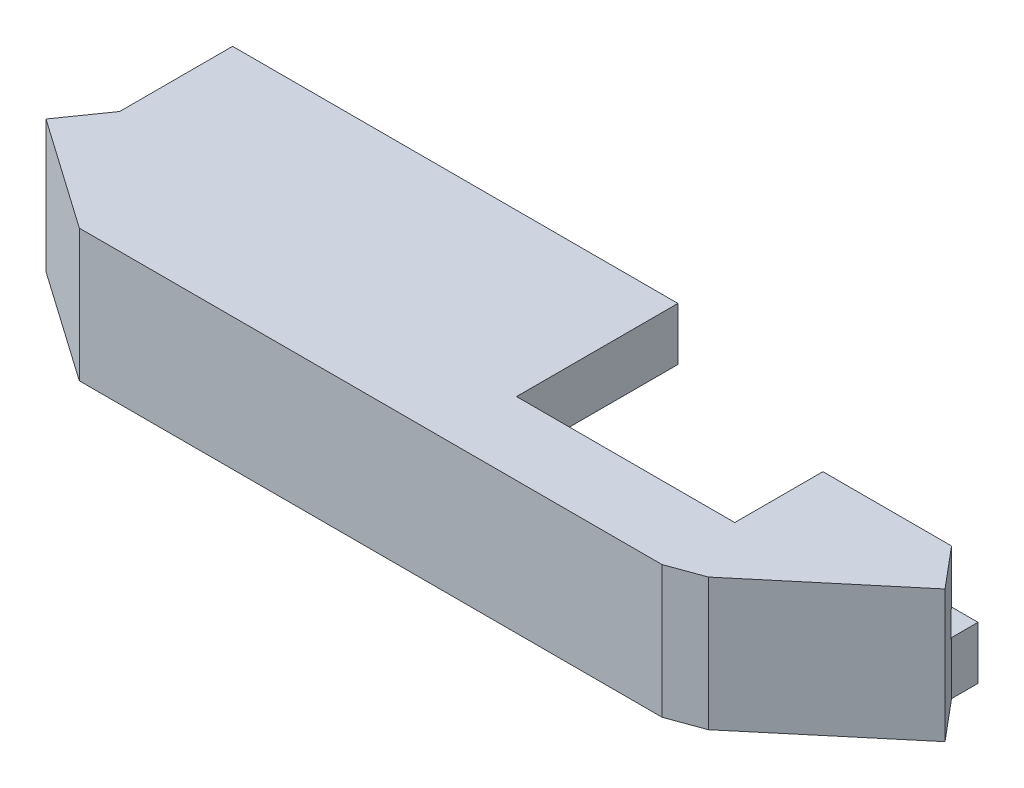
ISO-10303-21;
HEADER;
FILE_DESCRIPTION(('STEP AP214'),'2;1');
FILE_NAME('part.step','',(''),(''),'','','');
FILE_SCHEMA(('AUTOMOTIVE_DESIGN { 1 0 10303 214 1 1 1 1 }'));
ENDSEC;
DATA;
#1=APPLICATION_CONTEXT('core data for automotive mechanical design processes');
#2=APPLICATION_PROTOCOL_DEFINITION('international standard','automotive_design',2000,#1);
#3=PRODUCT_CONTEXT('',#1,'mechanical');
#4=PRODUCT('Part','Part','',(#3));
#5=PRODUCT_RELATED_PRODUCT_CATEGORY('part','',(#4));
#6=PRODUCT_DEFINITION_FORMATION('','',#4);
#7=PRODUCT_DEFINITION_CONTEXT('part definition',#1,'design');
#8=PRODUCT_DEFINITION('design','',#6,#7);
#9=PRODUCT_DEFINITION_SHAPE('','',#8);
#10=(LENGTH_UNIT() NAMED_UNIT(*) SI_UNIT(.MILLI.,.METRE.));
#11=(NAMED_UNIT(*) PLANE_ANGLE_UNIT() SI_UNIT($,.RADIAN.));
#12=(NAMED_UNIT(*) SI_UNIT($,.STERADIAN.) SOLID_ANGLE_UNIT());
#13=UNCERTAINTY_MEASURE_WITH_UNIT(LENGTH_MEASURE(1.E-05),#10,'distance_accuracy_value','');
#14=(GEOMETRIC_REPRESENTATION_CONTEXT(3) GLOBAL_UNCERTAINTY_ASSIGNED_CONTEXT((#13)) GLOBAL_UNIT_ASSIGNED_CONTEXT((#10,
#11,#12)) REPRESENTATION_CONTEXT('',''));
#15=CARTESIAN_POINT('',(0.,0.,0.));
#16=DIRECTION('',(0.,0.,1.));
#17=DIRECTION('',(1.,0.,0.));
#18=AXIS2_PLACEMENT_3D('',#15,#16,#17);
#19=CARTESIAN_POINT('',(0.,0.,0.));
#20=DIRECTION('',(0.,1.,0.));
#21=DIRECTION('',(0.,0.,1.));
#22=AXIS2_PLACEMENT_3D('',#19,#20,#21);
#23=PLANE('',#22);
#24=DIRECTION('',(0.819152044288997,0.,0.573576436351038));
#25=VECTOR('',#24,1.);
#26=CARTESIAN_POINT('',(-0.172072930905292,0.,0.245745613286671));
#27=LINE('',#26,#25);
#28=CARTESIAN_POINT('',(-7.54444132950627,0.,-4.91644231387267));
#29=VERTEX_POINT('',#28);
#30=CARTESIAN_POINT('',(-0.0945896366636159,0.,0.300000000000012));
#31=VERTEX_POINT('',#30);
#32=EDGE_CURVE('E391',#29,#31,#27,.T.);
#33=ORIENTED_EDGE('',*,*,#32,.F.);
#34=DIRECTION('',(-0.573576436351033,0.,0.819152044289002));
#35=VECTOR('',#34,1.);
#36=CARTESIAN_POINT('',(-7.37236839860101,0.,-5.16218792715929));
#37=LINE('',#36,#35);
#38=CARTESIAN_POINT('',(-7.37236839860095,0.,-5.16218792715937));
#39=VERTEX_POINT('',#38);
#40=EDGE_CURVE('E443',#39,#29,#37,.T.);
#41=ORIENTED_EDGE('',*,*,#40,.F.);
#42=DIRECTION('',(0.,0.,-1.));
#43=VECTOR('',#42,1.);
#44=CARTESIAN_POINT('',(-7.37236839860096,0.,0.));
#45=LINE('',#44,#43);
#46=CARTESIAN_POINT('',(-7.37236839860095,0.,-13.7));
#47=VERTEX_POINT('',#46);
#48=EDGE_CURVE('E500',#39,#47,#45,.T.);
#49=ORIENTED_EDGE('',*,*,#48,.T.);
#50=DIRECTION('',(-1.,0.,0.));
#51=VECTOR('',#50,1.);
#52=CARTESIAN_POINT('',(0.,0.,-13.7));
#53=LINE('',#52,#51);
#54=CARTESIAN_POINT('',(26.3,0.,-13.7));
#55=VERTEX_POINT('',#54);
#56=EDGE_CURVE('E496',#55,#47,#53,.T.);
#57=ORIENTED_EDGE('',*,*,#56,.F.);
#58=DIRECTION('',(0.,0.,-1.));
#59=VECTOR('',#58,1.);
#60=CARTESIAN_POINT('',(26.3,0.,0.));
#61=LINE('',#60,#59);
#62=CARTESIAN_POINT('',(26.3,0.,-1.5));
#63=VERTEX_POINT('',#62);
#64=EDGE_CURVE('E493',#63,#55,#61,.T.);
#65=ORIENTED_EDGE('',*,*,#64,.F.);
#66=DIRECTION('',(-1.,0.,0.));
#67=VECTOR('',#66,1.);
#68=CARTESIAN_POINT('',(0.,0.,-1.5));
#69=LINE('',#68,#67);
#70=CARTESIAN_POINT('',(42.8,0.,-1.5));
#71=VERTEX_POINT('',#70);
#72=EDGE_CURVE('E490',#71,#63,#69,.T.);
#73=ORIENTED_EDGE('',*,*,#72,.F.);
#74=DIRECTION('',(0.,0.,-1.));
#75=VECTOR('',#74,1.);
#76=CARTESIAN_POINT('',(42.8,0.,0.));
#77=LINE('',#76,#75);
#78=CARTESIAN_POINT('',(42.8,0.,-8.16340264301906));
#79=VERTEX_POINT('',#78);
#80=EDGE_CURVE('E486',#71,#79,#77,.T.);
#81=ORIENTED_EDGE('',*,*,#80,.T.);
#82=DIRECTION('',(-1.,0.,0.));
#83=VECTOR('',#82,1.);
#84=CARTESIAN_POINT('',(0.,0.,-8.16340264301906));
#85=LINE('',#84,#83);
#86=CARTESIAN_POINT('',(52.528764427611,0.,-8.16340264301906));
#87=VERTEX_POINT('',#86);
#88=EDGE_CURVE('E482',#87,#79,#85,.T.);
#89=ORIENTED_EDGE('',*,*,#88,.F.);
#90=DIRECTION('',(0.642787609686541,0.,0.766044443118976));
#91=VECTOR('',#90,1.);
#92=CARTESIAN_POINT('',(34.8448354296832,0.,-29.2382885574803));
#93=LINE('',#92,#91);
#94=CARTESIAN_POINT('',(52.721600710517,0.,-7.93358931008336));
#95=VERTEX_POINT('',#94);
#96=EDGE_CURVE('E406',#87,#95,#93,.T.);
#97=ORIENTED_EDGE('',*,*,#96,.T.);
#98=DIRECTION('',(0.766044443118977,0.,-0.64278760968654));
#99=VECTOR('',#98,1.);
#100=CARTESIAN_POINT('',(17.8767652808337,0.,21.304699247397));
#101=LINE('',#100,#99);
#102=CARTESIAN_POINT('',(42.992836282906,0.,0.22981333293569));
#103=VERTEX_POINT('',#102);
#104=EDGE_CURVE('E394',#103,#95,#101,.T.);
#105=ORIENTED_EDGE('',*,*,#104,.F.);
#106=DIRECTION('',(0.939692620785911,0.,-0.342020143325663));
#107=VECTOR('',#106,1.);
#108=CARTESIAN_POINT('',(5.10306705870667,0.,14.0205615137596));
#109=LINE('',#108,#107);
#110=CARTESIAN_POINT('',(42.8,0.,0.3));
#111=VERTEX_POINT('',#110);
#112=EDGE_CURVE('E398',#111,#103,#109,.T.);
#113=ORIENTED_EDGE('',*,*,#112,.F.);
#114=DIRECTION('',(1.,0.,0.));
#115=VECTOR('',#114,1.);
#116=CARTESIAN_POINT('',(0.,0.,0.3));
#117=LINE('',#116,#115);
#118=CARTESIAN_POINT('',(18.0588159097779,0.,0.3));
#119=VERTEX_POINT('',#118);
#120=EDGE_CURVE('E362',#119,#111,#117,.T.);
#121=ORIENTED_EDGE('',*,*,#120,.F.);
#122=DIRECTION('',(0.,0.,-1.));
#123=VECTOR('',#122,1.);
#124=CARTESIAN_POINT('',(18.0588159097779,0.,0.));
#125=LINE('',#124,#123);
#126=CARTESIAN_POINT('',(18.0588159097779,0.,-0.607570660968912));
#127=VERTEX_POINT('',#126);
#128=EDGE_CURVE('E246',#119,#127,#125,.T.);
#129=ORIENTED_EDGE('',*,*,#128,.T.);
#130=CARTESIAN_POINT('',(13.15,0.,0.95));
#131=DIRECTION('',(0.,1.,0.));
#132=DIRECTION('',(0.,0.,1.));
#133=AXIS2_PLACEMENT_3D('',#130,#131,#132);
#134=CIRCLE('',#133,5.15);
#135=CARTESIAN_POINT('',(8.24118409022208,0.,-0.607570660968924));
#136=VERTEX_POINT('',#135);
#137=EDGE_CURVE('E384',#127,#136,#134,.T.);
#138=ORIENTED_EDGE('',*,*,#137,.T.);
#139=DIRECTION('',(0.,0.,-1.));
#140=VECTOR('',#139,1.);
#141=CARTESIAN_POINT('',(8.24118409022208,0.,0.));
#142=LINE('',#141,#140);
#143=CARTESIAN_POINT('',(8.24118409022208,0.,0.300000000000003));
#144=VERTEX_POINT('',#143);
#145=EDGE_CURVE('E66',#144,#136,#142,.T.);
#146=ORIENTED_EDGE('',*,*,#145,.F.);
#147=EDGE_CURVE('E61',#31,#144,#117,.T.);
#148=ORIENTED_EDGE('',*,*,#147,.F.);
#149=EDGE_LOOP('',(#33,#41,#49,#57,#65,#73,#81,#89,#97,#105,#113,#121,#129,#138,#146,#148));
#150=FACE_BOUND('',#149,.T.);
#151=ADVANCED_FACE('F45',(#150),#23,.F.);
#152=CARTESIAN_POINT('',(20.2550794366737,4.,24.1390636869372));
#153=DIRECTION('',(-0.642787609686537,0.,-0.76604444311898));
#154=DIRECTION('',(-0.76604444311898,0.,0.642787609686537));
#155=AXIS2_PLACEMENT_3D('',#152,#153,#154);
#156=PLANE('',#155);
#157=DIRECTION('',(0.,-1.,0.));
#158=VECTOR('',#157,1.);
#159=CARTESIAN_POINT('',(45.3711504387462,4.,3.06417777247591));
#160=LINE('',#159,#158);
#161=CARTESIAN_POINT('',(45.3711504387462,4.,3.06417777247591));
#162=VERTEX_POINT('',#161);
#163=CARTESIAN_POINT('',(45.3711504387462,-6.,3.06417777247592));
#164=VERTEX_POINT('',#163);
#165=EDGE_CURVE('E479',#162,#164,#160,.T.);
#166=ORIENTED_EDGE('',*,*,#165,.T.);
#167=DIRECTION('',(0.76604444311898,0.,-0.642787609686537));
#168=VECTOR('',#167,1.);
#169=CARTESIAN_POINT('',(20.2550794366737,-6.,24.1390636869372));
#170=LINE('',#169,#168);
#171=CARTESIAN_POINT('',(55.0999148663572,-6.,-5.0992248705431));
#172=VERTEX_POINT('',#171);
#173=EDGE_CURVE('E259',#164,#172,#170,.T.);
#174=ORIENTED_EDGE('',*,*,#173,.T.);
#175=DIRECTION('',(0.,-1.,0.));
#176=VECTOR('',#175,1.);
#177=CARTESIAN_POINT('',(55.0999148663572,4.,-5.0992248705431));
#178=LINE('',#177,#176);
#179=CARTESIAN_POINT('',(55.0999148663572,4.,-5.0992248705431));
#180=VERTEX_POINT('',#179);
#181=EDGE_CURVE('E11',#180,#172,#178,.T.);
#182=ORIENTED_EDGE('',*,*,#181,.F.);
#183=DIRECTION('',(0.76604444311898,0.,-0.642787609686537));
#184=VECTOR('',#183,1.);
#185=CARTESIAN_POINT('',(20.2550794366737,4.,24.1390636869372));
#186=LINE('',#185,#184);
#187=EDGE_CURVE('E439',#162,#180,#186,.T.);
#188=ORIENTED_EDGE('',*,*,#187,.F.);
#189=EDGE_LOOP('',(#166,#174,#182,#188));
#190=FACE_BOUND('',#189,.T.);
#191=ADVANCED_FACE('F47',(#190),#156,.F.);
#192=CARTESIAN_POINT('',(34.8448354296832,4.,-29.2382885574803));
#193=DIRECTION('',(0.766044443118976,0.,-0.642787609686541));
#194=DIRECTION('',(-0.642787609686541,0.,-0.766044443118976));
#195=AXIS2_PLACEMENT_3D('',#192,#193,#194);
#196=PLANE('',#195);
#197=ORIENTED_EDGE('',*,*,#96,.F.);
#198=DIRECTION('',(0.,-1.,0.));
#199=VECTOR('',#198,1.);
#200=CARTESIAN_POINT('',(52.528764427611,4.,-8.16340264301906));
#201=LINE('',#200,#199);
#202=CARTESIAN_POINT('',(52.528764427611,4.,-8.16340264301906));
#203=VERTEX_POINT('',#202);
#204=EDGE_CURVE('E54',#203,#87,#201,.T.);
#205=ORIENTED_EDGE('',*,*,#204,.F.);
#206=DIRECTION('',(0.642787609686541,0.,0.766044443118976));
#207=VECTOR('',#206,1.);
#208=CARTESIAN_POINT('',(34.8448354296832,4.,-29.2382885574803));
#209=LINE('',#208,#207);
#210=EDGE_CURVE('E442',#203,#180,#209,.T.);
#211=ORIENTED_EDGE('',*,*,#210,.T.);
#212=ORIENTED_EDGE('',*,*,#181,.T.);
#213=DIRECTION('',(0.642787609686538,0.,0.76604444311898));
#214=VECTOR('',#213,1.);
#215=CARTESIAN_POINT('',(34.8448354296835,-6.,-29.2382885574803));
#216=LINE('',#215,#214);
#217=CARTESIAN_POINT('',(52.528764427611,-6.,-8.16340264301906));
#218=VERTEX_POINT('',#217);
#219=EDGE_CURVE('E250',#218,#172,#216,.T.);
#220=ORIENTED_EDGE('',*,*,#219,.F.);
#221=DIRECTION('',(0.,1.,0.));
#222=VECTOR('',#221,1.);
#223=CARTESIAN_POINT('',(52.528764427611,-6.,-8.16340264301906));
#224=LINE('',#223,#222);
#225=CARTESIAN_POINT('',(52.528764427611,-2.,-8.16340264301906));
#226=VERTEX_POINT('',#225);
#227=EDGE_CURVE('E234',#218,#226,#224,.T.);
#228=ORIENTED_EDGE('',*,*,#227,.T.);
#229=DIRECTION('',(0.642787609686538,0.,0.76604444311898));
#230=VECTOR('',#229,1.);
#231=CARTESIAN_POINT('',(34.8448354296835,-2.,-29.2382885574803));
#232=LINE('',#231,#230);
#233=CARTESIAN_POINT('',(52.721600710517,-2.,-7.93358931008337));
#234=VERTEX_POINT('',#233);
#235=EDGE_CURVE('E313',#226,#234,#232,.T.);
#236=ORIENTED_EDGE('',*,*,#235,.T.);
#237=DIRECTION('',(0.,1.,0.));
#238=VECTOR('',#237,1.);
#239=CARTESIAN_POINT('',(52.721600710517,-2.,-7.93358931008336));
#240=LINE('',#239,#238);
#241=EDGE_CURVE('E415',#234,#95,#240,.T.);
#242=ORIENTED_EDGE('',*,*,#241,.T.);
#243=EDGE_LOOP('',(#197,#205,#211,#212,#220,#228,#236,#242));
#244=FACE_BOUND('',#243,.T.);
#245=ADVANCED_FACE('F252',(#244),#196,.T.);
#246=CARTESIAN_POINT('',(0.,4.,-8.16340264301906));
#247=DIRECTION('',(0.,0.,1.));
#248=DIRECTION('',(1.,0.,0.));
#249=AXIS2_PLACEMENT_3D('',#246,#247,#248);
#250=PLANE('',#249);
#251=ORIENTED_EDGE('',*,*,#88,.T.);
#252=DIRECTION('',(0.,-1.,0.));
#253=VECTOR('',#252,1.);
#254=CARTESIAN_POINT('',(42.8,4.,-8.16340264301906));
#255=LINE('',#254,#253);
#256=CARTESIAN_POINT('',(42.8,4.,-8.16340264301906));
#257=VERTEX_POINT('',#256);
#258=EDGE_CURVE('E535',#257,#79,#255,.T.);
#259=ORIENTED_EDGE('',*,*,#258,.F.);
#260=DIRECTION('',(-1.,0.,0.));
#261=VECTOR('',#260,1.);
#262=CARTESIAN_POINT('',(0.,4.,-8.16340264301906));
#263=LINE('',#262,#261);
#264=EDGE_CURVE('E446',#203,#257,#263,.T.);
#265=ORIENTED_EDGE('',*,*,#264,.F.);
#266=ORIENTED_EDGE('',*,*,#204,.T.);
#267=EDGE_LOOP('',(#251,#259,#265,#266));
#268=FACE_BOUND('',#267,.T.);
#269=ADVANCED_FACE('F541',(#268),#250,.F.);
#270=CARTESIAN_POINT('',(42.8,4.,0.));
#271=DIRECTION('',(-1.,0.,0.));
#272=DIRECTION('',(0.,0.,1.));
#273=AXIS2_PLACEMENT_3D('',#270,#271,#272);
#274=PLANE('',#273);
#275=ORIENTED_EDGE('',*,*,#80,.F.);
#276=DIRECTION('',(0.,-1.,0.));
#277=VECTOR('',#276,1.);
#278=CARTESIAN_POINT('',(42.8,4.,-1.5));
#279=LINE('',#278,#277);
#280=CARTESIAN_POINT('',(42.8,4.,-1.5));
#281=VERTEX_POINT('',#280);
#282=EDGE_CURVE('E532',#281,#71,#279,.T.);
#283=ORIENTED_EDGE('',*,*,#282,.F.);
#284=DIRECTION('',(0.,0.,-1.));
#285=VECTOR('',#284,1.);
#286=CARTESIAN_POINT('',(42.8,4.,0.));
#287=LINE('',#286,#285);
#288=EDGE_CURVE('E449',#281,#257,#287,.T.);
#289=ORIENTED_EDGE('',*,*,#288,.T.);
#290=ORIENTED_EDGE('',*,*,#258,.T.);
#291=EDGE_LOOP('',(#275,#283,#289,#290));
#292=FACE_BOUND('',#291,.T.);
#293=ADVANCED_FACE('F610',(#292),#274,.T.);
#294=CARTESIAN_POINT('',(0.,4.,-1.5));
#295=DIRECTION('',(0.,0.,1.));
#296=DIRECTION('',(1.,0.,0.));
#297=AXIS2_PLACEMENT_3D('',#294,#295,#296);
#298=PLANE('',#297);
#299=ORIENTED_EDGE('',*,*,#72,.T.);
#300=DIRECTION('',(0.,-1.,0.));
#301=VECTOR('',#300,1.);
#302=CARTESIAN_POINT('',(26.3,4.,-1.5));
#303=LINE('',#302,#301);
#304=CARTESIAN_POINT('',(26.3,4.,-1.5));
#305=VERTEX_POINT('',#304);
#306=EDGE_CURVE('E528',#305,#63,#303,.T.);
#307=ORIENTED_EDGE('',*,*,#306,.F.);
#308=DIRECTION('',(-1.,0.,0.));
#309=VECTOR('',#308,1.);
#310=CARTESIAN_POINT('',(0.,4.,-1.5));
#311=LINE('',#310,#309);
#312=EDGE_CURVE('E453',#281,#305,#311,.T.);
#313=ORIENTED_EDGE('',*,*,#312,.F.);
#314=ORIENTED_EDGE('',*,*,#282,.T.);
#315=EDGE_LOOP('',(#299,#307,#313,#314));
#316=FACE_BOUND('',#315,.T.);
#317=ADVANCED_FACE('F607',(#316),#298,.F.);
#318=CARTESIAN_POINT('',(26.3,4.,0.));
#319=DIRECTION('',(-1.,0.,0.));
#320=DIRECTION('',(0.,0.,1.));
#321=AXIS2_PLACEMENT_3D('',#318,#319,#320);
#322=PLANE('',#321);
#323=ORIENTED_EDGE('',*,*,#64,.T.);
#324=DIRECTION('',(0.,-1.,0.));
#325=VECTOR('',#324,1.);
#326=CARTESIAN_POINT('',(26.3,4.,-13.7));
#327=LINE('',#326,#325);
#328=CARTESIAN_POINT('',(26.3,4.,-13.7));
#329=VERTEX_POINT('',#328);
#330=EDGE_CURVE('E524',#329,#55,#327,.T.);
#331=ORIENTED_EDGE('',*,*,#330,.F.);
#332=DIRECTION('',(0.,0.,-1.));
#333=VECTOR('',#332,1.);
#334=CARTESIAN_POINT('',(26.3,4.,0.));
#335=LINE('',#334,#333);
#336=EDGE_CURVE('E456',#305,#329,#335,.T.);
#337=ORIENTED_EDGE('',*,*,#336,.F.);
#338=ORIENTED_EDGE('',*,*,#306,.T.);
#339=EDGE_LOOP('',(#323,#331,#337,#338));
#340=FACE_BOUND('',#339,.T.);
#341=ADVANCED_FACE('F603',(#340),#322,.F.);
#342=CARTESIAN_POINT('',(0.,4.,-13.7));
#343=DIRECTION('',(0.,0.,1.));
#344=DIRECTION('',(1.,0.,0.));
#345=AXIS2_PLACEMENT_3D('',#342,#343,#344);
#346=PLANE('',#345);
#347=ORIENTED_EDGE('',*,*,#56,.T.);
#348=DIRECTION('',(0.,-1.,0.));
#349=VECTOR('',#348,1.);
#350=CARTESIAN_POINT('',(-7.37236839860095,4.,-13.7));
#351=LINE('',#350,#349);
#352=CARTESIAN_POINT('',(-7.37236839860095,4.,-13.7));
#353=VERTEX_POINT('',#352);
#354=EDGE_CURVE('E521',#353,#47,#351,.T.);
#355=ORIENTED_EDGE('',*,*,#354,.F.);
#356=DIRECTION('',(-1.,0.,0.));
#357=VECTOR('',#356,1.);
#358=CARTESIAN_POINT('',(0.,4.,-13.7));
#359=LINE('',#358,#357);
#360=EDGE_CURVE('E459',#329,#353,#359,.T.);
#361=ORIENTED_EDGE('',*,*,#360,.F.);
#362=ORIENTED_EDGE('',*,*,#330,.T.);
#363=EDGE_LOOP('',(#347,#355,#361,#362));
#364=FACE_BOUND('',#363,.T.);
#365=ADVANCED_FACE('F598',(#364),#346,.F.);
#366=CARTESIAN_POINT('',(-7.37236839860096,4.,0.));
#367=DIRECTION('',(-1.,0.,0.));
#368=DIRECTION('',(0.,0.,1.));
#369=AXIS2_PLACEMENT_3D('',#366,#367,#368);
#370=PLANE('',#369);
#371=ORIENTED_EDGE('',*,*,#48,.F.);
#372=DIRECTION('',(0.,-1.,0.));
#373=VECTOR('',#372,1.);
#374=CARTESIAN_POINT('',(-7.37236839860095,4.,-5.16218792715937));
#375=LINE('',#374,#373);
#376=CARTESIAN_POINT('',(-7.37236839860095,4.,-5.16218792715937));
#377=VERTEX_POINT('',#376);
#378=EDGE_CURVE('E518',#377,#39,#375,.T.);
#379=ORIENTED_EDGE('',*,*,#378,.F.);
#380=DIRECTION('',(0.,0.,-1.));
#381=VECTOR('',#380,1.);
#382=CARTESIAN_POINT('',(-7.37236839860096,4.,0.));
#383=LINE('',#382,#381);
#384=EDGE_CURVE('E462',#377,#353,#383,.T.);
#385=ORIENTED_EDGE('',*,*,#384,.T.);
#386=ORIENTED_EDGE('',*,*,#354,.T.);
#387=EDGE_LOOP('',(#371,#379,#385,#386));
#388=FACE_BOUND('',#387,.T.);
#389=ADVANCED_FACE('F593',(#388),#370,.T.);
#390=CARTESIAN_POINT('',(-7.37236839860101,4.,-5.16218792715929));
#391=DIRECTION('',(0.819152044289001,0.,0.573576436351032));
#392=DIRECTION('',(0.573576436351032,0.,-0.819152044289002));
#393=AXIS2_PLACEMENT_3D('',#390,#391,#392);
#394=PLANE('',#393);
#395=ORIENTED_EDGE('',*,*,#40,.T.);
#396=DIRECTION('',(0.,1.,0.));
#397=VECTOR('',#396,1.);
#398=CARTESIAN_POINT('',(-7.54444132950626,-2.,-4.91644231387267));
#399=LINE('',#398,#397);
#400=CARTESIAN_POINT('',(-7.54444132950627,-2.,-4.91644231387268));
#401=VERTEX_POINT('',#400);
#402=EDGE_CURVE('E419',#401,#29,#399,.T.);
#403=ORIENTED_EDGE('',*,*,#402,.F.);
#404=DIRECTION('',(-0.573576436351058,0.,0.819152044288984));
#405=VECTOR('',#404,1.);
#406=CARTESIAN_POINT('',(-7.37236839860085,-2.,-5.16218792715952));
#407=LINE('',#406,#405);
#408=CARTESIAN_POINT('',(-7.37236839860096,-2.,-5.16218792715937));
#409=VERTEX_POINT('',#408);
#410=EDGE_CURVE('E316',#409,#401,#407,.T.);
#411=ORIENTED_EDGE('',*,*,#410,.F.);
#412=DIRECTION('',(0.,1.,0.));
#413=VECTOR('',#412,1.);
#414=CARTESIAN_POINT('',(-7.37236839860096,-6.,-5.16218792715937));
#415=LINE('',#414,#413);
#416=CARTESIAN_POINT('',(-7.37236839860096,-6.,-5.16218792715937));
#417=VERTEX_POINT('',#416);
#418=EDGE_CURVE('E247',#417,#409,#415,.T.);
#419=ORIENTED_EDGE('',*,*,#418,.F.);
#420=DIRECTION('',(-0.573576436351058,0.,0.819152044288984));
#421=VECTOR('',#420,1.);
#422=CARTESIAN_POINT('',(-7.37236839860085,-6.,-5.16218792715952));
#423=LINE('',#422,#421);
#424=CARTESIAN_POINT('',(-9.66667414400513,-6.,-1.88557975000338));
#425=VERTEX_POINT('',#424);
#426=EDGE_CURVE('E287',#417,#425,#423,.T.);
#427=ORIENTED_EDGE('',*,*,#426,.T.);
#428=DIRECTION('',(0.,-1.,0.));
#429=VECTOR('',#428,1.);
#430=CARTESIAN_POINT('',(-9.66667414400511,4.,-1.88557975000338));
#431=LINE('',#430,#429);
#432=CARTESIAN_POINT('',(-9.66667414400511,4.,-1.88557975000338));
#433=VERTEX_POINT('',#432);
#434=EDGE_CURVE('E515',#433,#425,#431,.T.);
#435=ORIENTED_EDGE('',*,*,#434,.F.);
#436=DIRECTION('',(-0.573576436351033,0.,0.819152044289002));
#437=VECTOR('',#436,1.);
#438=CARTESIAN_POINT('',(-7.37236839860101,4.,-5.16218792715929));
#439=LINE('',#438,#437);
#440=EDGE_CURVE('E466',#377,#433,#439,.T.);
#441=ORIENTED_EDGE('',*,*,#440,.F.);
#442=ORIENTED_EDGE('',*,*,#378,.T.);
#443=EDGE_LOOP('',(#395,#403,#411,#419,#427,#435,#441,#442));
#444=FACE_BOUND('',#443,.T.);
#445=ADVANCED_FACE('F587',(#444),#394,.F.);
#446=CARTESIAN_POINT('',(-2.29430574540413,4.,3.27660817715596));
#447=DIRECTION('',(0.573576436351038,0.,-0.819152044288997));
#448=DIRECTION('',(-0.819152044288997,0.,-0.573576436351038));
#449=AXIS2_PLACEMENT_3D('',#446,#447,#448);
#450=PLANE('',#449);
#451=ORIENTED_EDGE('',*,*,#434,.T.);
#452=DIRECTION('',(0.819152044288997,0.,0.573576436351038));
#453=VECTOR('',#452,1.);
#454=CARTESIAN_POINT('',(-2.29430574540414,-6.,3.27660817715597));
#455=LINE('',#454,#453);
#456=CARTESIAN_POINT('',(-1.26119515551587,-6.,4.));
#457=VERTEX_POINT('',#456);
#458=EDGE_CURVE('E283',#425,#457,#455,.T.);
#459=ORIENTED_EDGE('',*,*,#458,.T.);
#460=DIRECTION('',(0.,-1.,0.));
#461=VECTOR('',#460,1.);
#462=CARTESIAN_POINT('',(-1.26119515551585,4.,4.));
#463=LINE('',#462,#461);
#464=CARTESIAN_POINT('',(-1.26119515551585,4.,4.));
#465=VERTEX_POINT('',#464);
#466=EDGE_CURVE('E512',#465,#457,#463,.T.);
#467=ORIENTED_EDGE('',*,*,#466,.F.);
#468=DIRECTION('',(0.819152044288997,0.,0.573576436351038));
#469=VECTOR('',#468,1.);
#470=CARTESIAN_POINT('',(-2.29430574540413,4.,3.27660817715596));
#471=LINE('',#470,#469);
#472=EDGE_CURVE('E469',#433,#465,#471,.T.);
#473=ORIENTED_EDGE('',*,*,#472,.F.);
#474=EDGE_LOOP('',(#451,#459,#467,#473));
#475=FACE_BOUND('',#474,.T.);
#476=ADVANCED_FACE('F628',(#475),#450,.F.);
#477=CARTESIAN_POINT('',(0.,4.,4.));
#478=DIRECTION('',(0.,0.,1.));
#479=DIRECTION('',(1.,0.,0.));
#480=AXIS2_PLACEMENT_3D('',#477,#478,#479);
#481=PLANE('',#480);
#482=ORIENTED_EDGE('',*,*,#466,.T.);
#483=DIRECTION('',(-1.,0.,0.));
#484=VECTOR('',#483,1.);
#485=CARTESIAN_POINT('',(0.,-6.,4.));
#486=LINE('',#485,#484);
#487=CARTESIAN_POINT('',(42.8,-6.,4.));
#488=VERTEX_POINT('',#487);
#489=EDGE_CURVE('E279',#488,#457,#486,.T.);
#490=ORIENTED_EDGE('',*,*,#489,.F.);
#491=DIRECTION('',(0.,-1.,0.));
#492=VECTOR('',#491,1.);
#493=CARTESIAN_POINT('',(42.8,4.,4.));
#494=LINE('',#493,#492);
#495=CARTESIAN_POINT('',(42.8,4.,4.));
#496=VERTEX_POINT('',#495);
#497=EDGE_CURVE('E509',#496,#488,#494,.T.);
#498=ORIENTED_EDGE('',*,*,#497,.F.);
#499=DIRECTION('',(-1.,0.,0.));
#500=VECTOR('',#499,1.);
#501=CARTESIAN_POINT('',(0.,4.,4.));
#502=LINE('',#501,#500);
#503=EDGE_CURVE('E472',#496,#465,#502,.T.);
#504=ORIENTED_EDGE('',*,*,#503,.T.);
#505=EDGE_LOOP('',(#482,#490,#498,#504));
#506=FACE_BOUND('',#505,.T.);
#507=ADVANCED_FACE('F623',(#506),#481,.T.);
#508=CARTESIAN_POINT('',(6.29222413662691,4.,17.2877437335299));
#509=DIRECTION('',(-0.342020143325668,0.,-0.939692620785909));
#510=DIRECTION('',(-0.939692620785909,0.,0.342020143325668));
#511=AXIS2_PLACEMENT_3D('',#508,#509,#510);
#512=PLANE('',#511);
#513=ORIENTED_EDGE('',*,*,#497,.T.);
#514=DIRECTION('',(0.939692620785909,0.,-0.342020143325667));
#515=VECTOR('',#514,1.);
#516=CARTESIAN_POINT('',(6.2922241366269,-6.,17.2877437335299));
#517=LINE('',#516,#515);
#518=EDGE_CURVE('E275',#488,#164,#517,.T.);
#519=ORIENTED_EDGE('',*,*,#518,.T.);
#520=ORIENTED_EDGE('',*,*,#165,.F.);
#521=DIRECTION('',(0.939692620785909,0.,-0.342020143325668));
#522=VECTOR('',#521,1.);
#523=CARTESIAN_POINT('',(6.29222413662691,4.,17.2877437335299));
#524=LINE('',#523,#522);
#525=EDGE_CURVE('E476',#496,#162,#524,.T.);
#526=ORIENTED_EDGE('',*,*,#525,.F.);
#527=EDGE_LOOP('',(#513,#519,#520,#526));
#528=FACE_BOUND('',#527,.T.);
#529=ADVANCED_FACE('F620',(#528),#512,.F.);
#530=CARTESIAN_POINT('',(0.,4.,0.));
#531=DIRECTION('',(0.,1.,0.));
#532=DIRECTION('',(0.,0.,1.));
#533=AXIS2_PLACEMENT_3D('',#530,#531,#532);
#534=PLANE('',#533);
#535=ORIENTED_EDGE('',*,*,#187,.T.);
#536=ORIENTED_EDGE('',*,*,#210,.F.);
#537=ORIENTED_EDGE('',*,*,#264,.T.);
#538=ORIENTED_EDGE('',*,*,#288,.F.);
#539=ORIENTED_EDGE('',*,*,#312,.T.);
#540=ORIENTED_EDGE('',*,*,#336,.T.);
#541=ORIENTED_EDGE('',*,*,#360,.T.);
#542=ORIENTED_EDGE('',*,*,#384,.F.);
#543=ORIENTED_EDGE('',*,*,#440,.T.);
#544=ORIENTED_EDGE('',*,*,#472,.T.);
#545=ORIENTED_EDGE('',*,*,#503,.F.);
#546=ORIENTED_EDGE('',*,*,#525,.T.);
#547=EDGE_LOOP('',(#535,#536,#537,#538,#539,#540,#541,#542,#543,#544,#545,#546));
#548=FACE_BOUND('',#547,.T.);
#549=ADVANCED_FACE('F612',(#548),#534,.T.);
#550=CARTESIAN_POINT('',(18.0588159097779,-2.,0.));
#551=DIRECTION('',(1.,0.,0.));
#552=DIRECTION('',(0.,0.,-1.));
#553=AXIS2_PLACEMENT_3D('',#550,#551,#552);
#554=PLANE('',#553);
#555=ORIENTED_EDGE('',*,*,#128,.F.);
#556=DIRECTION('',(0.,1.,0.));
#557=VECTOR('',#556,1.);
#558=CARTESIAN_POINT('',(18.0588159097779,-2.,0.3));
#559=LINE('',#558,#557);
#560=CARTESIAN_POINT('',(18.0588159097779,-2.,0.3));
#561=VERTEX_POINT('',#560);
#562=EDGE_CURVE('E402',#561,#119,#559,.T.);
#563=ORIENTED_EDGE('',*,*,#562,.F.);
#564=DIRECTION('',(0.,0.,-1.));
#565=VECTOR('',#564,1.);
#566=CARTESIAN_POINT('',(18.0588159097779,-2.,0.));
#567=LINE('',#566,#565);
#568=CARTESIAN_POINT('',(18.0588159097779,-2.,-0.607570660968912));
#569=VERTEX_POINT('',#568);
#570=EDGE_CURVE('E357',#561,#569,#567,.T.);
#571=ORIENTED_EDGE('',*,*,#570,.T.);
#572=DIRECTION('',(0.,1.,0.));
#573=VECTOR('',#572,1.);
#574=CARTESIAN_POINT('',(18.0588159097779,-2.,-0.607570660968912));
#575=LINE('',#574,#573);
#576=EDGE_CURVE('E435',#569,#127,#575,.T.);
#577=ORIENTED_EDGE('',*,*,#576,.T.);
#578=EDGE_LOOP('',(#555,#563,#571,#577));
#579=FACE_BOUND('',#578,.T.);
#580=ADVANCED_FACE('F567',(#579),#554,.T.);
#581=CARTESIAN_POINT('',(0.,-2.,0.3));
#582=DIRECTION('',(0.,0.,1.));
#583=DIRECTION('',(1.,0.,0.));
#584=AXIS2_PLACEMENT_3D('',#581,#582,#583);
#585=PLANE('',#584);
#586=ORIENTED_EDGE('',*,*,#120,.T.);
#587=DIRECTION('',(0.,1.,0.));
#588=VECTOR('',#587,1.);
#589=CARTESIAN_POINT('',(42.8,-2.,0.3));
#590=LINE('',#589,#588);
#591=CARTESIAN_POINT('',(42.8,-2.,0.3));
#592=VERTEX_POINT('',#591);
#593=EDGE_CURVE('E407',#592,#111,#590,.T.);
#594=ORIENTED_EDGE('',*,*,#593,.F.);
#595=DIRECTION('',(1.,0.,0.));
#596=VECTOR('',#595,1.);
#597=CARTESIAN_POINT('',(0.,-2.,0.3));
#598=LINE('',#597,#596);
#599=EDGE_CURVE('E373',#561,#592,#598,.T.);
#600=ORIENTED_EDGE('',*,*,#599,.F.);
#601=ORIENTED_EDGE('',*,*,#562,.T.);
#602=EDGE_LOOP('',(#586,#594,#600,#601));
#603=FACE_BOUND('',#602,.T.);
#604=ADVANCED_FACE('F558',(#603),#585,.F.);
#605=CARTESIAN_POINT('',(5.10306705870667,-2.,14.0205615137596));
#606=DIRECTION('',(0.342020143325663,0.,0.939692620785911));
#607=DIRECTION('',(0.939692620785911,0.,-0.342020143325663));
#608=AXIS2_PLACEMENT_3D('',#605,#606,#607);
#609=PLANE('',#608);
#610=ORIENTED_EDGE('',*,*,#112,.T.);
#611=DIRECTION('',(0.,1.,0.));
#612=VECTOR('',#611,1.);
#613=CARTESIAN_POINT('',(42.992836282906,-2.,0.22981333293569));
#614=LINE('',#613,#612);
#615=CARTESIAN_POINT('',(42.992836282906,-2.,0.22981333293569));
#616=VERTEX_POINT('',#615);
#617=EDGE_CURVE('E411',#616,#103,#614,.T.);
#618=ORIENTED_EDGE('',*,*,#617,.F.);
#619=DIRECTION('',(0.939692620785911,0.,-0.342020143325663));
#620=VECTOR('',#619,1.);
#621=CARTESIAN_POINT('',(5.10306705870667,-2.,14.0205615137596));
#622=LINE('',#621,#620);
#623=EDGE_CURVE('E379',#592,#616,#622,.T.);
#624=ORIENTED_EDGE('',*,*,#623,.F.);
#625=ORIENTED_EDGE('',*,*,#593,.T.);
#626=EDGE_LOOP('',(#610,#618,#624,#625));
#627=FACE_BOUND('',#626,.T.);
#628=ADVANCED_FACE('F553',(#627),#609,.F.);
#629=CARTESIAN_POINT('',(17.8767652808337,-2.,21.304699247397));
#630=DIRECTION('',(0.64278760968654,0.,0.766044443118977));
#631=DIRECTION('',(0.766044443118977,0.,-0.64278760968654));
#632=AXIS2_PLACEMENT_3D('',#629,#630,#631);
#633=PLANE('',#632);
#634=ORIENTED_EDGE('',*,*,#104,.T.);
#635=ORIENTED_EDGE('',*,*,#241,.F.);
#636=DIRECTION('',(0.766044443118977,0.,-0.64278760968654));
#637=VECTOR('',#636,1.);
#638=CARTESIAN_POINT('',(17.8767652808337,-2.,21.304699247397));
#639=LINE('',#638,#637);
#640=EDGE_CURVE('E376',#616,#234,#639,.T.);
#641=ORIENTED_EDGE('',*,*,#640,.F.);
#642=ORIENTED_EDGE('',*,*,#617,.T.);
#643=EDGE_LOOP('',(#634,#635,#641,#642));
#644=FACE_BOUND('',#643,.T.);
#645=ADVANCED_FACE('F549',(#644),#633,.F.);
#646=CARTESIAN_POINT('',(-0.172072930905292,-2.,0.245745613286671));
#647=DIRECTION('',(-0.573576436351038,0.,0.819152044288997));
#648=DIRECTION('',(0.819152044288997,0.,0.573576436351038));
#649=AXIS2_PLACEMENT_3D('',#646,#647,#648);
#650=PLANE('',#649);
#651=ORIENTED_EDGE('',*,*,#32,.T.);
#652=DIRECTION('',(0.,1.,0.));
#653=VECTOR('',#652,1.);
#654=CARTESIAN_POINT('',(-0.0945896366636159,-2.,0.300000000000012));
#655=LINE('',#654,#653);
#656=CARTESIAN_POINT('',(-0.0945896366636159,-2.,0.300000000000012));
#657=VERTEX_POINT('',#656);
#658=EDGE_CURVE('E423',#657,#31,#655,.T.);
#659=ORIENTED_EDGE('',*,*,#658,.F.);
#660=DIRECTION('',(0.819152044288997,0.,0.573576436351038));
#661=VECTOR('',#660,1.);
#662=CARTESIAN_POINT('',(-0.172072930905292,-2.,0.245745613286671));
#663=LINE('',#662,#661);
#664=EDGE_CURVE('E372',#401,#657,#663,.T.);
#665=ORIENTED_EDGE('',*,*,#664,.F.);
#666=ORIENTED_EDGE('',*,*,#402,.T.);
#667=EDGE_LOOP('',(#651,#659,#665,#666));
#668=FACE_BOUND('',#667,.T.);
#669=ADVANCED_FACE('F582',(#668),#650,.F.);
#670=ORIENTED_EDGE('',*,*,#147,.T.);
#671=DIRECTION('',(0.,1.,0.));
#672=VECTOR('',#671,1.);
#673=CARTESIAN_POINT('',(8.24118409022208,-2.,0.300000000000003));
#674=LINE('',#673,#672);
#675=CARTESIAN_POINT('',(8.24118409022208,-2.,0.300000000000003));
#676=VERTEX_POINT('',#675);
#677=EDGE_CURVE('E427',#676,#144,#674,.T.);
#678=ORIENTED_EDGE('',*,*,#677,.F.);
#679=EDGE_CURVE('E369',#657,#676,#598,.T.);
#680=ORIENTED_EDGE('',*,*,#679,.F.);
#681=ORIENTED_EDGE('',*,*,#658,.T.);
#682=EDGE_LOOP('',(#670,#678,#680,#681));
#683=FACE_BOUND('',#682,.T.);
#684=ADVANCED_FACE('F578',(#683),#585,.F.);
#685=CARTESIAN_POINT('',(8.24118409022208,-2.,0.));
#686=DIRECTION('',(1.,0.,0.));
#687=DIRECTION('',(0.,0.,-1.));
#688=AXIS2_PLACEMENT_3D('',#685,#686,#687);
#689=PLANE('',#688);
#690=ORIENTED_EDGE('',*,*,#145,.T.);
#691=DIRECTION('',(0.,1.,0.));
#692=VECTOR('',#691,1.);
#693=CARTESIAN_POINT('',(8.24118409022208,-2.,-0.607570660968924));
#694=LINE('',#693,#692);
#695=CARTESIAN_POINT('',(8.24118409022208,-2.,-0.607570660968924));
#696=VERTEX_POINT('',#695);
#697=EDGE_CURVE('E431',#696,#136,#694,.T.);
#698=ORIENTED_EDGE('',*,*,#697,.F.);
#699=DIRECTION('',(0.,0.,-1.));
#700=VECTOR('',#699,1.);
#701=CARTESIAN_POINT('',(8.24118409022208,-2.,0.));
#702=LINE('',#701,#700);
#703=EDGE_CURVE('E366',#676,#696,#702,.T.);
#704=ORIENTED_EDGE('',*,*,#703,.F.);
#705=ORIENTED_EDGE('',*,*,#677,.T.);
#706=EDGE_LOOP('',(#690,#698,#704,#705));
#707=FACE_BOUND('',#706,.T.);
#708=ADVANCED_FACE('F574',(#707),#689,.F.);
#709=CARTESIAN_POINT('',(13.15,-2.,0.95));
#710=DIRECTION('',(0.,1.,0.));
#711=DIRECTION('',(0.,0.,1.));
#712=AXIS2_PLACEMENT_3D('',#709,#710,#711);
#713=CYLINDRICAL_SURFACE('',#712,5.15);
#714=ORIENTED_EDGE('',*,*,#137,.F.);
#715=ORIENTED_EDGE('',*,*,#576,.F.);
#716=CARTESIAN_POINT('',(13.15,-2.,0.95));
#717=DIRECTION('',(0.,1.,0.));
#718=DIRECTION('',(0.,0.,1.));
#719=AXIS2_PLACEMENT_3D('',#716,#717,#718);
#720=CIRCLE('',#719,5.15);
#721=EDGE_CURVE('E361',#569,#696,#720,.T.);
#722=ORIENTED_EDGE('',*,*,#721,.T.);
#723=ORIENTED_EDGE('',*,*,#697,.T.);
#724=EDGE_LOOP('',(#714,#715,#722,#723));
#725=FACE_BOUND('',#724,.T.);
#726=ADVANCED_FACE('F571',(#725),#713,.T.);
#727=CARTESIAN_POINT('',(0.,-2.,0.));
#728=DIRECTION('',(0.,-1.,0.));
#729=DIRECTION('',(0.,0.,-1.));
#730=AXIS2_PLACEMENT_3D('',#727,#728,#729);
#731=PLANE('',#730);
#732=ORIENTED_EDGE('',*,*,#623,.T.);
#733=ORIENTED_EDGE('',*,*,#640,.T.);
#734=ORIENTED_EDGE('',*,*,#235,.F.);
#735=DIRECTION('',(0.,0.,-1.));
#736=VECTOR('',#735,1.);
#737=CARTESIAN_POINT('',(52.528764427611,-2.,0.));
#738=LINE('',#737,#736);
#739=CARTESIAN_POINT('',(52.528764427611,-2.,-10.1634026430191));
#740=VERTEX_POINT('',#739);
#741=EDGE_CURVE('E241',#226,#740,#738,.T.);
#742=ORIENTED_EDGE('',*,*,#741,.T.);
#743=DIRECTION('',(-1.,0.,0.));
#744=VECTOR('',#743,1.);
#745=CARTESIAN_POINT('',(0.,-2.,-10.1634026430191));
#746=LINE('',#745,#744);
#747=CARTESIAN_POINT('',(44.028764427611,-2.,-10.1634026430191));
#748=VERTEX_POINT('',#747);
#749=EDGE_CURVE('E266',#740,#748,#746,.T.);
#750=ORIENTED_EDGE('',*,*,#749,.T.);
#751=DIRECTION('',(0.,0.,1.));
#752=VECTOR('',#751,1.);
#753=CARTESIAN_POINT('',(44.028764427611,-2.,0.));
#754=LINE('',#753,#752);
#755=CARTESIAN_POINT('',(44.028764427611,-2.,-1.03105577801216));
#756=VERTEX_POINT('',#755);
#757=EDGE_CURVE('E270',#748,#756,#754,.T.);
#758=ORIENTED_EDGE('',*,*,#757,.T.);
#759=DIRECTION('',(0.766044443118977,0.,-0.64278760968654));
#760=VECTOR('',#759,1.);
#761=CARTESIAN_POINT('',(17.6839289979277,-2.,21.0748859144613));
#762=LINE('',#761,#760);
#763=CARTESIAN_POINT('',(42.8,-2.,0.));
#764=VERTEX_POINT('',#763);
#765=EDGE_CURVE('E330',#764,#756,#762,.T.);
#766=ORIENTED_EDGE('',*,*,#765,.F.);
#767=DIRECTION('',(1.,0.,0.));
#768=VECTOR('',#767,1.);
#769=CARTESIAN_POINT('',(0.,-2.,0.));
#770=LINE('',#769,#768);
#771=CARTESIAN_POINT('',(18.2588159097779,-2.,0.));
#772=VERTEX_POINT('',#771);
#773=EDGE_CURVE('E327',#772,#764,#770,.T.);
#774=ORIENTED_EDGE('',*,*,#773,.F.);
#775=DIRECTION('',(0.,0.,-1.));
#776=VECTOR('',#775,1.);
#777=CARTESIAN_POINT('',(18.2588159097779,-2.,0.));
#778=LINE('',#777,#776);
#779=CARTESIAN_POINT('',(18.2588159097779,-2.,-5.16218792715937));
#780=VERTEX_POINT('',#779);
#781=EDGE_CURVE('E323',#772,#780,#778,.T.);
#782=ORIENTED_EDGE('',*,*,#781,.T.);
#783=DIRECTION('',(1.,0.,0.));
#784=VECTOR('',#783,1.);
#785=CARTESIAN_POINT('',(0.,-2.,-5.16218792715937));
#786=LINE('',#785,#784);
#787=EDGE_CURVE('E319',#409,#780,#786,.T.);
#788=ORIENTED_EDGE('',*,*,#787,.F.);
#789=ORIENTED_EDGE('',*,*,#410,.T.);
#790=ORIENTED_EDGE('',*,*,#664,.T.);
#791=ORIENTED_EDGE('',*,*,#679,.T.);
#792=ORIENTED_EDGE('',*,*,#703,.T.);
#793=ORIENTED_EDGE('',*,*,#721,.F.);
#794=ORIENTED_EDGE('',*,*,#570,.F.);
#795=ORIENTED_EDGE('',*,*,#599,.T.);
#796=EDGE_LOOP('',(#732,#733,#734,#742,#750,#758,#766,#774,#782,#788,#789,#790,#791,#792,#793,
#794,#795));
#797=FACE_BOUND('',#796,.T.);
#798=ADVANCED_FACE('F564',(#797),#731,.F.);
#799=CARTESIAN_POINT('',(52.528764427611,-6.,0.));
#800=DIRECTION('',(1.,0.,0.));
#801=DIRECTION('',(0.,0.,-1.));
#802=AXIS2_PLACEMENT_3D('',#799,#800,#801);
#803=PLANE('',#802);
#804=ORIENTED_EDGE('',*,*,#741,.F.);
#805=ORIENTED_EDGE('',*,*,#227,.F.);
#806=DIRECTION('',(0.,0.,-1.));
#807=VECTOR('',#806,1.);
#808=CARTESIAN_POINT('',(52.528764427611,-6.,0.));
#809=LINE('',#808,#807);
#810=CARTESIAN_POINT('',(52.528764427611,-6.,-10.1634026430191));
#811=VERTEX_POINT('',#810);
#812=EDGE_CURVE('E238',#218,#811,#809,.T.);
#813=ORIENTED_EDGE('',*,*,#812,.T.);
#814=DIRECTION('',(0.,1.,0.));
#815=VECTOR('',#814,1.);
#816=CARTESIAN_POINT('',(52.528764427611,-6.,-10.1634026430191));
#817=LINE('',#816,#815);
#818=EDGE_CURVE('E310',#811,#740,#817,.T.);
#819=ORIENTED_EDGE('',*,*,#818,.T.);
#820=EDGE_LOOP('',(#804,#805,#813,#819));
#821=FACE_BOUND('',#820,.T.);
#822=ADVANCED_FACE('F236',(#821),#803,.T.);
#823=CARTESIAN_POINT('',(0.,-6.,-5.16218792715937));
#824=DIRECTION('',(0.,0.,1.));
#825=DIRECTION('',(1.,0.,0.));
#826=AXIS2_PLACEMENT_3D('',#823,#824,#825);
#827=PLANE('',#826);
#828=ORIENTED_EDGE('',*,*,#787,.T.);
#829=DIRECTION('',(0.,1.,0.));
#830=VECTOR('',#829,1.);
#831=CARTESIAN_POINT('',(18.2588159097779,-6.,-5.16218792715937));
#832=LINE('',#831,#830);
#833=CARTESIAN_POINT('',(18.2588159097779,-6.,-5.16218792715937));
#834=VERTEX_POINT('',#833);
#835=EDGE_CURVE('E352',#834,#780,#832,.T.);
#836=ORIENTED_EDGE('',*,*,#835,.F.);
#837=DIRECTION('',(1.,0.,0.));
#838=VECTOR('',#837,1.);
#839=CARTESIAN_POINT('',(0.,-6.,-5.16218792715937));
#840=LINE('',#839,#838);
#841=EDGE_CURVE('E291',#417,#834,#840,.T.);
#842=ORIENTED_EDGE('',*,*,#841,.F.);
#843=ORIENTED_EDGE('',*,*,#418,.T.);
#844=EDGE_LOOP('',(#828,#836,#842,#843));
#845=FACE_BOUND('',#844,.T.);
#846=ADVANCED_FACE('F634',(#845),#827,.F.);
#847=CARTESIAN_POINT('',(18.2588159097779,-6.,0.));
#848=DIRECTION('',(1.,0.,0.));
#849=DIRECTION('',(0.,0.,-1.));
#850=AXIS2_PLACEMENT_3D('',#847,#848,#849);
#851=PLANE('',#850);
#852=ORIENTED_EDGE('',*,*,#781,.F.);
#853=DIRECTION('',(0.,1.,0.));
#854=VECTOR('',#853,1.);
#855=CARTESIAN_POINT('',(18.2588159097779,-6.,0.));
#856=LINE('',#855,#854);
#857=CARTESIAN_POINT('',(18.2588159097779,-6.,0.));
#858=VERTEX_POINT('',#857);
#859=EDGE_CURVE('E349',#858,#772,#856,.T.);
#860=ORIENTED_EDGE('',*,*,#859,.F.);
#861=DIRECTION('',(0.,0.,-1.));
#862=VECTOR('',#861,1.);
#863=CARTESIAN_POINT('',(18.2588159097779,-6.,0.));
#864=LINE('',#863,#862);
#865=EDGE_CURVE('E294',#858,#834,#864,.T.);
#866=ORIENTED_EDGE('',*,*,#865,.T.);
#867=ORIENTED_EDGE('',*,*,#835,.T.);
#868=EDGE_LOOP('',(#852,#860,#866,#867));
#869=FACE_BOUND('',#868,.T.);
#870=ADVANCED_FACE('F638',(#869),#851,.T.);
#871=CARTESIAN_POINT('',(0.,-6.,0.));
#872=DIRECTION('',(0.,0.,1.));
#873=DIRECTION('',(1.,0.,0.));
#874=AXIS2_PLACEMENT_3D('',#871,#872,#873);
#875=PLANE('',#874);
#876=ORIENTED_EDGE('',*,*,#773,.T.);
#877=DIRECTION('',(0.,1.,0.));
#878=VECTOR('',#877,1.);
#879=CARTESIAN_POINT('',(42.8,-6.,0.));
#880=LINE('',#879,#878);
#881=CARTESIAN_POINT('',(42.8,-6.,0.));
#882=VERTEX_POINT('',#881);
#883=EDGE_CURVE('E345',#882,#764,#880,.T.);
#884=ORIENTED_EDGE('',*,*,#883,.F.);
#885=DIRECTION('',(1.,0.,0.));
#886=VECTOR('',#885,1.);
#887=CARTESIAN_POINT('',(0.,-6.,0.));
#888=LINE('',#887,#886);
#889=EDGE_CURVE('E298',#858,#882,#888,.T.);
#890=ORIENTED_EDGE('',*,*,#889,.F.);
#891=ORIENTED_EDGE('',*,*,#859,.T.);
#892=EDGE_LOOP('',(#876,#884,#890,#891));
#893=FACE_BOUND('',#892,.T.);
#894=ADVANCED_FACE('F643',(#893),#875,.F.);
#895=CARTESIAN_POINT('',(17.6839289979277,-6.,21.0748859144613));
#896=DIRECTION('',(0.64278760968654,0.,0.766044443118977));
#897=DIRECTION('',(0.766044443118977,0.,-0.64278760968654));
#898=AXIS2_PLACEMENT_3D('',#895,#896,#897);
#899=PLANE('',#898);
#900=ORIENTED_EDGE('',*,*,#765,.T.);
#901=DIRECTION('',(0.,1.,0.));
#902=VECTOR('',#901,1.);
#903=CARTESIAN_POINT('',(44.028764427611,-6.,-1.03105577801216));
#904=LINE('',#903,#902);
#905=CARTESIAN_POINT('',(44.028764427611,-6.,-1.03105577801216));
#906=VERTEX_POINT('',#905);
#907=EDGE_CURVE('E342',#906,#756,#904,.T.);
#908=ORIENTED_EDGE('',*,*,#907,.F.);
#909=DIRECTION('',(0.766044443118977,0.,-0.64278760968654));
#910=VECTOR('',#909,1.);
#911=CARTESIAN_POINT('',(17.6839289979277,-6.,21.0748859144613));
#912=LINE('',#911,#910);
#913=EDGE_CURVE('E301',#882,#906,#912,.T.);
#914=ORIENTED_EDGE('',*,*,#913,.F.);
#915=ORIENTED_EDGE('',*,*,#883,.T.);
#916=EDGE_LOOP('',(#900,#908,#914,#915));
#917=FACE_BOUND('',#916,.T.);
#918=ADVANCED_FACE('F647',(#917),#899,.F.);
#919=CARTESIAN_POINT('',(44.028764427611,-6.,0.));
#920=DIRECTION('',(-1.,0.,0.));
#921=DIRECTION('',(0.,0.,1.));
#922=AXIS2_PLACEMENT_3D('',#919,#920,#921);
#923=PLANE('',#922);
#924=ORIENTED_EDGE('',*,*,#757,.F.);
#925=DIRECTION('',(0.,1.,0.));
#926=VECTOR('',#925,1.);
#927=CARTESIAN_POINT('',(44.028764427611,-6.,-10.1634026430191));
#928=LINE('',#927,#926);
#929=CARTESIAN_POINT('',(44.028764427611,-6.,-10.1634026430191));
#930=VERTEX_POINT('',#929);
#931=EDGE_CURVE('E339',#930,#748,#928,.T.);
#932=ORIENTED_EDGE('',*,*,#931,.F.);
#933=DIRECTION('',(0.,0.,1.));
#934=VECTOR('',#933,1.);
#935=CARTESIAN_POINT('',(44.028764427611,-6.,0.));
#936=LINE('',#935,#934);
#937=EDGE_CURVE('E304',#930,#906,#936,.T.);
#938=ORIENTED_EDGE('',*,*,#937,.T.);
#939=ORIENTED_EDGE('',*,*,#907,.T.);
#940=EDGE_LOOP('',(#924,#932,#938,#939));
#941=FACE_BOUND('',#940,.T.);
#942=ADVANCED_FACE('F651',(#941),#923,.T.);
#943=CARTESIAN_POINT('',(0.,-6.,-10.1634026430191));
#944=DIRECTION('',(0.,0.,-1.));
#945=DIRECTION('',(-1.,0.,0.));
#946=AXIS2_PLACEMENT_3D('',#943,#944,#945);
#947=PLANE('',#946);
#948=ORIENTED_EDGE('',*,*,#749,.F.);
#949=ORIENTED_EDGE('',*,*,#818,.F.);
#950=DIRECTION('',(-1.,0.,0.));
#951=VECTOR('',#950,1.);
#952=CARTESIAN_POINT('',(0.,-6.,-10.1634026430191));
#953=LINE('',#952,#951);
#954=EDGE_CURVE('E264',#811,#930,#953,.T.);
#955=ORIENTED_EDGE('',*,*,#954,.T.);
#956=ORIENTED_EDGE('',*,*,#931,.T.);
#957=EDGE_LOOP('',(#948,#949,#955,#956));
#958=FACE_BOUND('',#957,.T.);
#959=ADVANCED_FACE('F654',(#958),#947,.T.);
#960=CARTESIAN_POINT('',(0.,-6.,0.));
#961=DIRECTION('',(0.,-1.,0.));
#962=DIRECTION('',(0.,0.,-1.));
#963=AXIS2_PLACEMENT_3D('',#960,#961,#962);
#964=PLANE('',#963);
#965=ORIENTED_EDGE('',*,*,#812,.F.);
#966=ORIENTED_EDGE('',*,*,#219,.T.);
#967=ORIENTED_EDGE('',*,*,#173,.F.);
#968=ORIENTED_EDGE('',*,*,#518,.F.);
#969=ORIENTED_EDGE('',*,*,#489,.T.);
#970=ORIENTED_EDGE('',*,*,#458,.F.);
#971=ORIENTED_EDGE('',*,*,#426,.F.);
#972=ORIENTED_EDGE('',*,*,#841,.T.);
#973=ORIENTED_EDGE('',*,*,#865,.F.);
#974=ORIENTED_EDGE('',*,*,#889,.T.);
#975=ORIENTED_EDGE('',*,*,#913,.T.);
#976=ORIENTED_EDGE('',*,*,#937,.F.);
#977=ORIENTED_EDGE('',*,*,#954,.F.);
#978=EDGE_LOOP('',(#965,#966,#967,#968,#969,#970,#971,#972,#973,#974,#975,#976,#977));
#979=FACE_BOUND('',#978,.T.);
#980=ADVANCED_FACE('F261',(#979),#964,.T.);
#981=CLOSED_SHELL('',(#151,#191,#245,#269,#293,#317,#341,#365,#389,#445,#476,#507,#529,#549,
#580,#604,#628,#645,#669,#684,#708,#726,#798,#822,#846,#870,#894,#918,#942,#959,#980));
#982=MANIFOLD_SOLID_BREP('B2',#981);
#983=ADVANCED_BREP_SHAPE_REPRESENTATION('',(#18,#982),#14);
#984=SHAPE_DEFINITION_REPRESENTATION(#9,#983);
ENDSEC;
END-ISO-10303-21;
